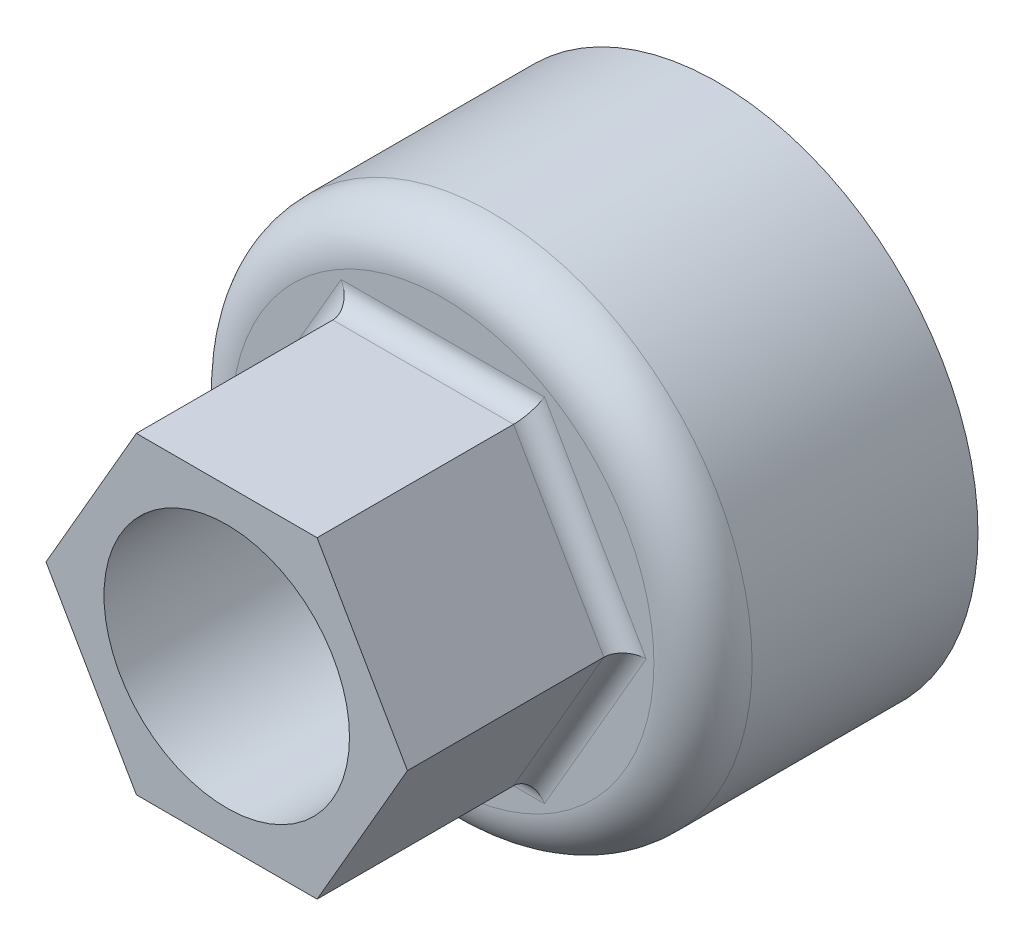
ISO-10303-21;
HEADER;
FILE_DESCRIPTION(('STEP AP214'),'2;1');
FILE_NAME('part.step','',(''),(''),'','','');
FILE_SCHEMA(('AUTOMOTIVE_DESIGN { 1 0 10303 214 1 1 1 1 }'));
ENDSEC;
DATA;
#1=APPLICATION_CONTEXT('core data for automotive mechanical design processes');
#2=APPLICATION_PROTOCOL_DEFINITION('international standard','automotive_design',2000,#1);
#3=PRODUCT_CONTEXT('',#1,'mechanical');
#4=PRODUCT('Part','Part','',(#3));
#5=PRODUCT_RELATED_PRODUCT_CATEGORY('part','',(#4));
#6=PRODUCT_DEFINITION_FORMATION('','',#4);
#7=PRODUCT_DEFINITION_CONTEXT('part definition',#1,'design');
#8=PRODUCT_DEFINITION('design','',#6,#7);
#9=PRODUCT_DEFINITION_SHAPE('','',#8);
#10=(LENGTH_UNIT() NAMED_UNIT(*) SI_UNIT(.MILLI.,.METRE.));
#11=(NAMED_UNIT(*) PLANE_ANGLE_UNIT() SI_UNIT($,.RADIAN.));
#12=(NAMED_UNIT(*) SI_UNIT($,.STERADIAN.) SOLID_ANGLE_UNIT());
#13=UNCERTAINTY_MEASURE_WITH_UNIT(LENGTH_MEASURE(1.E-05),#10,'distance_accuracy_value','');
#14=(GEOMETRIC_REPRESENTATION_CONTEXT(3) GLOBAL_UNCERTAINTY_ASSIGNED_CONTEXT((#13)) GLOBAL_UNIT_ASSIGNED_CONTEXT((#10,
#11,#12)) REPRESENTATION_CONTEXT('',''));
#15=CARTESIAN_POINT('',(0.,0.,0.));
#16=DIRECTION('',(0.,0.,1.));
#17=DIRECTION('',(1.,0.,0.));
#18=AXIS2_PLACEMENT_3D('',#15,#16,#17);
#19=CARTESIAN_POINT('',(0.,0.,25.));
#20=DIRECTION('',(0.,0.,-1.));
#21=DIRECTION('',(-1.,0.,0.));
#22=AXIS2_PLACEMENT_3D('',#19,#20,#21);
#23=CYLINDRICAL_SURFACE('',#22,26.5);
#24=CARTESIAN_POINT('',(0.,0.,23.));
#25=DIRECTION('',(0.,0.,1.));
#26=DIRECTION('',(1.,0.,0.));
#27=AXIS2_PLACEMENT_3D('',#24,#25,#26);
#28=CIRCLE('',#27,26.5);
#29=CARTESIAN_POINT('',(26.5,0.,23.));
#30=VERTEX_POINT('',#29);
#31=EDGE_CURVE('E11',#30,#30,#28,.F.);
#32=ORIENTED_EDGE('',*,*,#31,.T.);
#33=EDGE_LOOP('',(#32));
#34=FACE_BOUND('',#33,.T.);
#35=CARTESIAN_POINT('',(0.,0.,0.));
#36=DIRECTION('',(0.,0.,1.));
#37=DIRECTION('',(1.,0.,0.));
#38=AXIS2_PLACEMENT_3D('',#35,#36,#37);
#39=CIRCLE('',#38,26.5);
#40=CARTESIAN_POINT('',(26.5,0.,0.));
#41=VERTEX_POINT('',#40);
#42=EDGE_CURVE('E235',#41,#41,#39,.T.);
#43=ORIENTED_EDGE('',*,*,#42,.T.);
#44=EDGE_LOOP('',(#43));
#45=FACE_BOUND('',#44,.T.);
#46=ADVANCED_FACE('F35',(#34,#45),#23,.T.);
#47=CARTESIAN_POINT('',(0.,0.,0.));
#48=DIRECTION('',(0.,0.,1.));
#49=DIRECTION('',(1.,0.,0.));
#50=AXIS2_PLACEMENT_3D('',#47,#48,#49);
#51=PLANE('',#50);
#52=ORIENTED_EDGE('',*,*,#42,.F.);
#53=EDGE_LOOP('',(#52));
#54=FACE_BOUND('',#53,.T.);
#55=DIRECTION('',(-0.5,0.866025403784438,0.));
#56=VECTOR('',#55,1.);
#57=CARTESIAN_POINT('',(20.8423447177455,0.,0.));
#58=LINE('',#57,#56);
#59=CARTESIAN_POINT('',(20.8423447177455,0.,0.));
#60=VERTEX_POINT('',#59);
#61=CARTESIAN_POINT('',(10.4211723588727,18.05,0.));
#62=VERTEX_POINT('',#61);
#63=EDGE_CURVE('E200',#60,#62,#58,.T.);
#64=ORIENTED_EDGE('',*,*,#63,.T.);
#65=DIRECTION('',(-1.,0.,0.));
#66=VECTOR('',#65,1.);
#67=CARTESIAN_POINT('',(10.4211723588727,18.05,0.));
#68=LINE('',#67,#66);
#69=CARTESIAN_POINT('',(-10.4211723588727,18.05,0.));
#70=VERTEX_POINT('',#69);
#71=EDGE_CURVE('E208',#62,#70,#68,.T.);
#72=ORIENTED_EDGE('',*,*,#71,.T.);
#73=DIRECTION('',(-0.5,-0.866025403784439,0.));
#74=VECTOR('',#73,1.);
#75=CARTESIAN_POINT('',(-10.4211723588727,18.05,0.));
#76=LINE('',#75,#74);
#77=CARTESIAN_POINT('',(-20.8423447177455,0.,0.));
#78=VERTEX_POINT('',#77);
#79=EDGE_CURVE('E211',#70,#78,#76,.T.);
#80=ORIENTED_EDGE('',*,*,#79,.T.);
#81=DIRECTION('',(0.5,-0.866025403784439,0.));
#82=VECTOR('',#81,1.);
#83=CARTESIAN_POINT('',(-20.8423447177455,0.,0.));
#84=LINE('',#83,#82);
#85=CARTESIAN_POINT('',(-10.4211723588727,-18.05,0.));
#86=VERTEX_POINT('',#85);
#87=EDGE_CURVE('E214',#78,#86,#84,.T.);
#88=ORIENTED_EDGE('',*,*,#87,.T.);
#89=DIRECTION('',(1.,0.,0.));
#90=VECTOR('',#89,1.);
#91=CARTESIAN_POINT('',(-10.4211723588727,-18.05,0.));
#92=LINE('',#91,#90);
#93=CARTESIAN_POINT('',(10.4211723588727,-18.05,0.));
#94=VERTEX_POINT('',#93);
#95=EDGE_CURVE('E217',#86,#94,#92,.T.);
#96=ORIENTED_EDGE('',*,*,#95,.T.);
#97=DIRECTION('',(0.5,0.866025403784439,0.));
#98=VECTOR('',#97,1.);
#99=CARTESIAN_POINT('',(10.4211723588727,-18.05,0.));
#100=LINE('',#99,#98);
#101=EDGE_CURVE('E220',#94,#60,#100,.T.);
#102=ORIENTED_EDGE('',*,*,#101,.T.);
#103=EDGE_LOOP('',(#64,#72,#80,#88,#96,#102));
#104=FACE_BOUND('',#103,.T.);
#105=ADVANCED_FACE('F340',(#54,#104),#51,.F.);
#106=CARTESIAN_POINT('',(20.8423447177455,0.,25.));
#107=DIRECTION('',(-0.866025403784438,-0.5,0.));
#108=DIRECTION('',(0.5,-0.866025403784439,0.));
#109=AXIS2_PLACEMENT_3D('',#106,#107,#108);
#110=PLANE('',#109);
#111=DIRECTION('',(0.,0.,-1.));
#112=VECTOR('',#111,1.);
#113=CARTESIAN_POINT('',(20.8423447177455,0.,25.));
#114=LINE('',#113,#112);
#115=CARTESIAN_POINT('',(20.8423447177455,0.,20.));
#116=VERTEX_POINT('',#115);
#117=EDGE_CURVE('E223',#116,#60,#114,.T.);
#118=ORIENTED_EDGE('',*,*,#117,.F.);
#119=DIRECTION('',(-0.5,0.866025403784439,0.));
#120=VECTOR('',#119,1.);
#121=CARTESIAN_POINT('',(20.8423447177455,0.,20.));
#122=LINE('',#121,#120);
#123=CARTESIAN_POINT('',(10.4211723588727,18.05,20.));
#124=VERTEX_POINT('',#123);
#125=EDGE_CURVE('E302',#116,#124,#122,.T.);
#126=ORIENTED_EDGE('',*,*,#125,.T.);
#127=DIRECTION('',(0.,0.,-1.));
#128=VECTOR('',#127,1.);
#129=CARTESIAN_POINT('',(10.4211723588727,18.05,25.));
#130=LINE('',#129,#128);
#131=EDGE_CURVE('E233',#124,#62,#130,.T.);
#132=ORIENTED_EDGE('',*,*,#131,.T.);
#133=ORIENTED_EDGE('',*,*,#63,.F.);
#134=EDGE_LOOP('',(#118,#126,#132,#133));
#135=FACE_BOUND('',#134,.T.);
#136=ADVANCED_FACE('F346',(#135),#110,.T.);
#137=CARTESIAN_POINT('',(10.4211723588727,18.05,25.));
#138=DIRECTION('',(0.,-1.,0.));
#139=DIRECTION('',(1.,0.,0.));
#140=AXIS2_PLACEMENT_3D('',#137,#138,#139);
#141=PLANE('',#140);
#142=ORIENTED_EDGE('',*,*,#131,.F.);
#143=DIRECTION('',(-1.,0.,0.));
#144=VECTOR('',#143,1.);
#145=CARTESIAN_POINT('',(10.4211723588727,18.05,20.));
#146=LINE('',#145,#144);
#147=CARTESIAN_POINT('',(-10.4211723588727,18.05,20.));
#148=VERTEX_POINT('',#147);
#149=EDGE_CURVE('E263',#124,#148,#146,.T.);
#150=ORIENTED_EDGE('',*,*,#149,.T.);
#151=DIRECTION('',(0.,0.,-1.));
#152=VECTOR('',#151,1.);
#153=CARTESIAN_POINT('',(-10.4211723588727,18.05,25.));
#154=LINE('',#153,#152);
#155=EDGE_CURVE('E231',#148,#70,#154,.T.);
#156=ORIENTED_EDGE('',*,*,#155,.T.);
#157=ORIENTED_EDGE('',*,*,#71,.F.);
#158=EDGE_LOOP('',(#142,#150,#156,#157));
#159=FACE_BOUND('',#158,.T.);
#160=ADVANCED_FACE('F416',(#159),#141,.T.);
#161=CARTESIAN_POINT('',(-10.4211723588727,18.05,25.));
#162=DIRECTION('',(0.866025403784439,-0.5,0.));
#163=DIRECTION('',(0.5,0.866025403784439,0.));
#164=AXIS2_PLACEMENT_3D('',#161,#162,#163);
#165=PLANE('',#164);
#166=ORIENTED_EDGE('',*,*,#155,.F.);
#167=DIRECTION('',(-0.5,-0.866025403784439,0.));
#168=VECTOR('',#167,1.);
#169=CARTESIAN_POINT('',(-10.4211723588727,18.05,20.));
#170=LINE('',#169,#168);
#171=CARTESIAN_POINT('',(-20.8423447177455,0.,20.));
#172=VERTEX_POINT('',#171);
#173=EDGE_CURVE('E296',#148,#172,#170,.T.);
#174=ORIENTED_EDGE('',*,*,#173,.T.);
#175=DIRECTION('',(0.,0.,-1.));
#176=VECTOR('',#175,1.);
#177=CARTESIAN_POINT('',(-20.8423447177455,0.,25.));
#178=LINE('',#177,#176);
#179=EDGE_CURVE('E229',#172,#78,#178,.T.);
#180=ORIENTED_EDGE('',*,*,#179,.T.);
#181=ORIENTED_EDGE('',*,*,#79,.F.);
#182=EDGE_LOOP('',(#166,#174,#180,#181));
#183=FACE_BOUND('',#182,.T.);
#184=ADVANCED_FACE('F431',(#183),#165,.T.);
#185=CARTESIAN_POINT('',(-20.8423447177455,0.,25.));
#186=DIRECTION('',(0.866025403784439,0.5,0.));
#187=DIRECTION('',(-0.5,0.866025403784439,0.));
#188=AXIS2_PLACEMENT_3D('',#185,#186,#187);
#189=PLANE('',#188);
#190=ORIENTED_EDGE('',*,*,#179,.F.);
#191=DIRECTION('',(0.5,-0.866025403784439,0.));
#192=VECTOR('',#191,1.);
#193=CARTESIAN_POINT('',(-20.8423447177455,0.,20.));
#194=LINE('',#193,#192);
#195=CARTESIAN_POINT('',(-10.4211723588727,-18.05,20.));
#196=VERTEX_POINT('',#195);
#197=EDGE_CURVE('E298',#172,#196,#194,.T.);
#198=ORIENTED_EDGE('',*,*,#197,.T.);
#199=DIRECTION('',(0.,0.,-1.));
#200=VECTOR('',#199,1.);
#201=CARTESIAN_POINT('',(-10.4211723588727,-18.05,25.));
#202=LINE('',#201,#200);
#203=EDGE_CURVE('E227',#196,#86,#202,.T.);
#204=ORIENTED_EDGE('',*,*,#203,.T.);
#205=ORIENTED_EDGE('',*,*,#87,.F.);
#206=EDGE_LOOP('',(#190,#198,#204,#205));
#207=FACE_BOUND('',#206,.T.);
#208=ADVANCED_FACE('F427',(#207),#189,.T.);
#209=CARTESIAN_POINT('',(-10.4211723588727,-18.05,25.));
#210=DIRECTION('',(0.,1.,0.));
#211=DIRECTION('',(-1.,0.,0.));
#212=AXIS2_PLACEMENT_3D('',#209,#210,#211);
#213=PLANE('',#212);
#214=ORIENTED_EDGE('',*,*,#203,.F.);
#215=DIRECTION('',(1.,0.,0.));
#216=VECTOR('',#215,1.);
#217=CARTESIAN_POINT('',(-10.4211723588727,-18.05,20.));
#218=LINE('',#217,#216);
#219=CARTESIAN_POINT('',(10.4211723588727,-18.05,20.));
#220=VERTEX_POINT('',#219);
#221=EDGE_CURVE('E58',#196,#220,#218,.T.);
#222=ORIENTED_EDGE('',*,*,#221,.T.);
#223=DIRECTION('',(0.,0.,-1.));
#224=VECTOR('',#223,1.);
#225=CARTESIAN_POINT('',(10.4211723588727,-18.05,25.));
#226=LINE('',#225,#224);
#227=EDGE_CURVE('E225',#220,#94,#226,.T.);
#228=ORIENTED_EDGE('',*,*,#227,.T.);
#229=ORIENTED_EDGE('',*,*,#95,.F.);
#230=EDGE_LOOP('',(#214,#222,#228,#229));
#231=FACE_BOUND('',#230,.T.);
#232=ADVANCED_FACE('F423',(#231),#213,.T.);
#233=CARTESIAN_POINT('',(10.4211723588727,-18.05,25.));
#234=DIRECTION('',(-0.866025403784439,0.5,0.));
#235=DIRECTION('',(-0.5,-0.866025403784439,0.));
#236=AXIS2_PLACEMENT_3D('',#233,#234,#235);
#237=PLANE('',#236);
#238=ORIENTED_EDGE('',*,*,#227,.F.);
#239=DIRECTION('',(0.5,0.866025403784439,0.));
#240=VECTOR('',#239,1.);
#241=CARTESIAN_POINT('',(10.4211723588727,-18.05,20.));
#242=LINE('',#241,#240);
#243=EDGE_CURVE('E50',#220,#116,#242,.T.);
#244=ORIENTED_EDGE('',*,*,#243,.T.);
#245=ORIENTED_EDGE('',*,*,#117,.T.);
#246=ORIENTED_EDGE('',*,*,#101,.F.);
#247=EDGE_LOOP('',(#238,#244,#245,#246));
#248=FACE_BOUND('',#247,.T.);
#249=ADVANCED_FACE('F422',(#248),#237,.T.);
#250=CARTESIAN_POINT('',(0.,0.,25.));
#251=DIRECTION('',(0.,0.,1.));
#252=DIRECTION('',(1.,0.,0.));
#253=AXIS2_PLACEMENT_3D('',#250,#251,#252);
#254=PLANE('',#253);
#255=CARTESIAN_POINT('',(0.,0.,25.));
#256=DIRECTION('',(0.,0.,1.));
#257=DIRECTION('',(1.,0.,0.));
#258=AXIS2_PLACEMENT_3D('',#255,#256,#257);
#259=CIRCLE('',#258,12.5);
#260=CARTESIAN_POINT('',(12.5,0.,25.));
#261=VERTEX_POINT('',#260);
#262=EDGE_CURVE('E307',#261,#261,#259,.T.);
#263=ORIENTED_EDGE('',*,*,#262,.T.);
#264=EDGE_LOOP('',(#263));
#265=FACE_BOUND('',#264,.T.);
#266=DIRECTION('',(-0.5,-0.866025403784439,0.));
#267=VECTOR('',#266,1.);
#268=CARTESIAN_POINT('',(-11.3016315193869,6.525,25.));
#269=LINE('',#268,#267);
#270=CARTESIAN_POINT('',(-15.0688420258492,0.,25.));
#271=VERTEX_POINT('',#270);
#272=CARTESIAN_POINT('',(-7.53442101292462,13.05,25.));
#273=VERTEX_POINT('',#272);
#274=EDGE_CURVE('E291',#271,#273,#269,.F.);
#275=ORIENTED_EDGE('',*,*,#274,.T.);
#276=DIRECTION('',(-1.,0.,0.));
#277=VECTOR('',#276,1.);
#278=CARTESIAN_POINT('',(0.,13.05,25.));
#279=LINE('',#278,#277);
#280=CARTESIAN_POINT('',(7.53442101292461,13.05,25.));
#281=VERTEX_POINT('',#280);
#282=EDGE_CURVE('E293',#273,#281,#279,.F.);
#283=ORIENTED_EDGE('',*,*,#282,.T.);
#284=DIRECTION('',(-0.5,0.866025403784439,0.));
#285=VECTOR('',#284,1.);
#286=CARTESIAN_POINT('',(11.3016315193869,6.525,25.));
#287=LINE('',#286,#285);
#288=CARTESIAN_POINT('',(15.0688420258492,0.,25.));
#289=VERTEX_POINT('',#288);
#290=EDGE_CURVE('E283',#281,#289,#287,.F.);
#291=ORIENTED_EDGE('',*,*,#290,.T.);
#292=DIRECTION('',(0.5,0.866025403784439,0.));
#293=VECTOR('',#292,1.);
#294=CARTESIAN_POINT('',(11.3016315193869,-6.525,25.));
#295=LINE('',#294,#293);
#296=CARTESIAN_POINT('',(7.53442101292462,-13.05,25.));
#297=VERTEX_POINT('',#296);
#298=EDGE_CURVE('E285',#289,#297,#295,.F.);
#299=ORIENTED_EDGE('',*,*,#298,.T.);
#300=DIRECTION('',(1.,0.,0.));
#301=VECTOR('',#300,1.);
#302=CARTESIAN_POINT('',(0.,-13.05,25.));
#303=LINE('',#302,#301);
#304=CARTESIAN_POINT('',(-7.53442101292462,-13.05,25.));
#305=VERTEX_POINT('',#304);
#306=EDGE_CURVE('E287',#297,#305,#303,.F.);
#307=ORIENTED_EDGE('',*,*,#306,.T.);
#308=DIRECTION('',(0.5,-0.866025403784439,0.));
#309=VECTOR('',#308,1.);
#310=CARTESIAN_POINT('',(-11.3016315193869,-6.525,25.));
#311=LINE('',#310,#309);
#312=EDGE_CURVE('E289',#305,#271,#311,.F.);
#313=ORIENTED_EDGE('',*,*,#312,.T.);
#314=EDGE_LOOP('',(#275,#283,#291,#299,#307,#313));
#315=FACE_BOUND('',#314,.T.);
#316=ADVANCED_FACE('F403',(#265,#315),#254,.F.);
#317=CARTESIAN_POINT('',(0.,0.,28.));
#318=DIRECTION('',(0.,0.,1.));
#319=DIRECTION('',(1.,0.,0.));
#320=AXIS2_PLACEMENT_3D('',#317,#318,#319);
#321=PLANE('',#320);
#322=CARTESIAN_POINT('',(0.,0.,28.));
#323=DIRECTION('',(0.,0.,1.));
#324=DIRECTION('',(1.,0.,0.));
#325=AXIS2_PLACEMENT_3D('',#322,#323,#324);
#326=CIRCLE('',#325,21.5);
#327=CARTESIAN_POINT('',(21.5,0.,28.));
#328=VERTEX_POINT('',#327);
#329=EDGE_CURVE('E43',#328,#328,#326,.T.);
#330=ORIENTED_EDGE('',*,*,#329,.T.);
#331=EDGE_LOOP('',(#330));
#332=FACE_BOUND('',#331,.T.);
#333=DIRECTION('',(-1.,0.,0.));
#334=VECTOR('',#333,1.);
#335=CARTESIAN_POINT('',(9.20178694020821,17.9379625008644,28.));
#336=LINE('',#335,#334);
#337=CARTESIAN_POINT('',(-10.3564874785875,17.9379625008644,28.));
#338=VERTEX_POINT('',#337);
#339=CARTESIAN_POINT('',(10.3564874785875,17.9379625008644,28.));
#340=VERTEX_POINT('',#339);
#341=EDGE_CURVE('E249',#338,#340,#336,.F.);
#342=ORIENTED_EDGE('',*,*,#341,.T.);
#343=DIRECTION('',(-0.5,0.866025403784439,0.));
#344=VECTOR('',#343,1.);
#345=CARTESIAN_POINT('',(20.1356246879853,0.999999999999995,28.));
#346=LINE('',#345,#344);
#347=CARTESIAN_POINT('',(20.7129749571749,0.,28.));
#348=VERTEX_POINT('',#347);
#349=EDGE_CURVE('E251',#340,#348,#346,.F.);
#350=ORIENTED_EDGE('',*,*,#349,.T.);
#351=DIRECTION('',(0.5,0.866025403784439,0.));
#352=VECTOR('',#351,1.);
#353=CARTESIAN_POINT('',(10.9338377477771,-16.9379625008644,28.));
#354=LINE('',#353,#352);
#355=CARTESIAN_POINT('',(10.3564874785875,-17.9379625008644,28.));
#356=VERTEX_POINT('',#355);
#357=EDGE_CURVE('E241',#348,#356,#354,.F.);
#358=ORIENTED_EDGE('',*,*,#357,.T.);
#359=DIRECTION('',(1.,0.,0.));
#360=VECTOR('',#359,1.);
#361=CARTESIAN_POINT('',(-9.20178694020821,-17.9379625008644,28.));
#362=LINE('',#361,#360);
#363=CARTESIAN_POINT('',(-10.3564874785875,-17.9379625008644,28.));
#364=VERTEX_POINT('',#363);
#365=EDGE_CURVE('E243',#356,#364,#362,.F.);
#366=ORIENTED_EDGE('',*,*,#365,.T.);
#367=DIRECTION('',(0.5,-0.866025403784439,0.));
#368=VECTOR('',#367,1.);
#369=CARTESIAN_POINT('',(-20.1356246879853,-1.00000000000001,28.));
#370=LINE('',#369,#368);
#371=CARTESIAN_POINT('',(-20.7129749571749,0.,28.));
#372=VERTEX_POINT('',#371);
#373=EDGE_CURVE('E245',#364,#372,#370,.F.);
#374=ORIENTED_EDGE('',*,*,#373,.T.);
#375=DIRECTION('',(-0.5,-0.866025403784439,0.));
#376=VECTOR('',#375,1.);
#377=CARTESIAN_POINT('',(-10.9338377477771,16.9379625008644,28.));
#378=LINE('',#377,#376);
#379=EDGE_CURVE('E247',#372,#338,#378,.F.);
#380=ORIENTED_EDGE('',*,*,#379,.T.);
#381=EDGE_LOOP('',(#342,#350,#358,#366,#374,#380));
#382=FACE_BOUND('',#381,.T.);
#383=ADVANCED_FACE('F322',(#332,#382),#321,.T.);
#384=CARTESIAN_POINT('',(18.4035738804164,0.,28.));
#385=DIRECTION('',(0.866025403784439,0.5,0.));
#386=DIRECTION('',(-0.5,0.866025403784439,0.));
#387=AXIS2_PLACEMENT_3D('',#384,#385,#386);
#388=PLANE('',#387);
#389=DIRECTION('',(0.,0.,1.));
#390=VECTOR('',#389,1.);
#391=CARTESIAN_POINT('',(18.4035738804164,0.,28.));
#392=LINE('',#391,#390);
#393=CARTESIAN_POINT('',(18.4035738804164,0.,30.));
#394=VERTEX_POINT('',#393);
#395=CARTESIAN_POINT('',(18.4035738804164,0.,50.));
#396=VERTEX_POINT('',#395);
#397=EDGE_CURVE('E198',#394,#396,#392,.T.);
#398=ORIENTED_EDGE('',*,*,#397,.F.);
#399=DIRECTION('',(-0.5,0.866025403784439,0.));
#400=VECTOR('',#399,1.);
#401=CARTESIAN_POINT('',(9.20178694020821,15.9379625008644,30.));
#402=LINE('',#401,#400);
#403=CARTESIAN_POINT('',(9.20178694020821,15.9379625008644,30.));
#404=VERTEX_POINT('',#403);
#405=EDGE_CURVE('E238',#394,#404,#402,.T.);
#406=ORIENTED_EDGE('',*,*,#405,.T.);
#407=DIRECTION('',(0.,0.,1.));
#408=VECTOR('',#407,1.);
#409=CARTESIAN_POINT('',(9.20178694020821,15.9379625008644,28.));
#410=LINE('',#409,#408);
#411=CARTESIAN_POINT('',(9.20178694020821,15.9379625008644,50.));
#412=VERTEX_POINT('',#411);
#413=EDGE_CURVE('E197',#404,#412,#410,.T.);
#414=ORIENTED_EDGE('',*,*,#413,.T.);
#415=DIRECTION('',(-0.5,0.866025403784439,0.));
#416=VECTOR('',#415,1.);
#417=CARTESIAN_POINT('',(18.4035738804164,0.,50.));
#418=LINE('',#417,#416);
#419=EDGE_CURVE('E190',#396,#412,#418,.T.);
#420=ORIENTED_EDGE('',*,*,#419,.F.);
#421=EDGE_LOOP('',(#398,#406,#414,#420));
#422=FACE_BOUND('',#421,.T.);
#423=ADVANCED_FACE('F527',(#422),#388,.T.);
#424=CARTESIAN_POINT('',(9.20178694020821,-15.9379625008644,28.));
#425=DIRECTION('',(0.866025403784439,-0.5,0.));
#426=DIRECTION('',(0.5,0.866025403784439,0.));
#427=AXIS2_PLACEMENT_3D('',#424,#425,#426);
#428=PLANE('',#427);
#429=DIRECTION('',(0.,0.,1.));
#430=VECTOR('',#429,1.);
#431=CARTESIAN_POINT('',(9.20178694020821,-15.9379625008644,28.));
#432=LINE('',#431,#430);
#433=CARTESIAN_POINT('',(9.20178694020821,-15.9379625008644,30.));
#434=VERTEX_POINT('',#433);
#435=CARTESIAN_POINT('',(9.20178694020821,-15.9379625008644,50.));
#436=VERTEX_POINT('',#435);
#437=EDGE_CURVE('E201',#434,#436,#432,.T.);
#438=ORIENTED_EDGE('',*,*,#437,.F.);
#439=DIRECTION('',(0.5,0.866025403784439,0.));
#440=VECTOR('',#439,1.);
#441=CARTESIAN_POINT('',(18.4035738804164,0.,30.));
#442=LINE('',#441,#440);
#443=EDGE_CURVE('E261',#434,#394,#442,.T.);
#444=ORIENTED_EDGE('',*,*,#443,.T.);
#445=ORIENTED_EDGE('',*,*,#397,.T.);
#446=DIRECTION('',(0.5,0.866025403784439,0.));
#447=VECTOR('',#446,1.);
#448=CARTESIAN_POINT('',(9.20178694020821,-15.9379625008644,50.));
#449=LINE('',#448,#447);
#450=EDGE_CURVE('E195',#436,#396,#449,.T.);
#451=ORIENTED_EDGE('',*,*,#450,.F.);
#452=EDGE_LOOP('',(#438,#444,#445,#451));
#453=FACE_BOUND('',#452,.T.);
#454=ADVANCED_FACE('F624',(#453),#428,.T.);
#455=CARTESIAN_POINT('',(-9.20178694020821,-15.9379625008644,28.));
#456=DIRECTION('',(0.,-1.,0.));
#457=DIRECTION('',(0.,0.,-1.));
#458=AXIS2_PLACEMENT_3D('',#455,#456,#457);
#459=PLANE('',#458);
#460=DIRECTION('',(0.,0.,1.));
#461=VECTOR('',#460,1.);
#462=CARTESIAN_POINT('',(-9.20178694020821,-15.9379625008644,28.));
#463=LINE('',#462,#461);
#464=CARTESIAN_POINT('',(-9.20178694020821,-15.9379625008644,30.));
#465=VERTEX_POINT('',#464);
#466=CARTESIAN_POINT('',(-9.20178694020821,-15.9379625008644,50.));
#467=VERTEX_POINT('',#466);
#468=EDGE_CURVE('E172',#465,#467,#463,.T.);
#469=ORIENTED_EDGE('',*,*,#468,.F.);
#470=DIRECTION('',(1.,0.,0.));
#471=VECTOR('',#470,1.);
#472=CARTESIAN_POINT('',(9.2017869402082,-15.9379625008644,30.));
#473=LINE('',#472,#471);
#474=EDGE_CURVE('E259',#465,#434,#473,.T.);
#475=ORIENTED_EDGE('',*,*,#474,.T.);
#476=ORIENTED_EDGE('',*,*,#437,.T.);
#477=DIRECTION('',(1.,0.,0.));
#478=VECTOR('',#477,1.);
#479=CARTESIAN_POINT('',(-9.20178694020821,-15.9379625008644,50.));
#480=LINE('',#479,#478);
#481=EDGE_CURVE('E182',#467,#436,#480,.T.);
#482=ORIENTED_EDGE('',*,*,#481,.F.);
#483=EDGE_LOOP('',(#469,#475,#476,#482));
#484=FACE_BOUND('',#483,.T.);
#485=ADVANCED_FACE('F616',(#484),#459,.T.);
#486=CARTESIAN_POINT('',(-18.4035738804164,0.,28.));
#487=DIRECTION('',(-0.866025403784439,-0.5,0.));
#488=DIRECTION('',(0.5,-0.866025403784439,0.));
#489=AXIS2_PLACEMENT_3D('',#486,#487,#488);
#490=PLANE('',#489);
#491=DIRECTION('',(0.,0.,1.));
#492=VECTOR('',#491,1.);
#493=CARTESIAN_POINT('',(-18.4035738804164,0.,28.));
#494=LINE('',#493,#492);
#495=CARTESIAN_POINT('',(-18.4035738804164,0.,30.));
#496=VERTEX_POINT('',#495);
#497=CARTESIAN_POINT('',(-18.4035738804164,0.,50.));
#498=VERTEX_POINT('',#497);
#499=EDGE_CURVE('E161',#496,#498,#494,.T.);
#500=ORIENTED_EDGE('',*,*,#499,.F.);
#501=DIRECTION('',(0.5,-0.866025403784439,0.));
#502=VECTOR('',#501,1.);
#503=CARTESIAN_POINT('',(-9.20178694020821,-15.9379625008644,30.));
#504=LINE('',#503,#502);
#505=EDGE_CURVE('E257',#496,#465,#504,.T.);
#506=ORIENTED_EDGE('',*,*,#505,.T.);
#507=ORIENTED_EDGE('',*,*,#468,.T.);
#508=DIRECTION('',(0.5,-0.866025403784439,0.));
#509=VECTOR('',#508,1.);
#510=CARTESIAN_POINT('',(-18.4035738804164,0.,50.));
#511=LINE('',#510,#509);
#512=EDGE_CURVE('E176',#498,#467,#511,.T.);
#513=ORIENTED_EDGE('',*,*,#512,.F.);
#514=EDGE_LOOP('',(#500,#506,#507,#513));
#515=FACE_BOUND('',#514,.T.);
#516=ADVANCED_FACE('F177',(#515),#490,.T.);
#517=CARTESIAN_POINT('',(-9.2017869402082,15.9379625008644,28.));
#518=DIRECTION('',(-0.866025403784439,0.5,0.));
#519=DIRECTION('',(-0.5,-0.866025403784439,0.));
#520=AXIS2_PLACEMENT_3D('',#517,#518,#519);
#521=PLANE('',#520);
#522=DIRECTION('',(0.,0.,1.));
#523=VECTOR('',#522,1.);
#524=CARTESIAN_POINT('',(-9.2017869402082,15.9379625008644,28.));
#525=LINE('',#524,#523);
#526=CARTESIAN_POINT('',(-9.2017869402082,15.9379625008644,30.));
#527=VERTEX_POINT('',#526);
#528=CARTESIAN_POINT('',(-9.2017869402082,15.9379625008644,50.));
#529=VERTEX_POINT('',#528);
#530=EDGE_CURVE('E173',#527,#529,#525,.T.);
#531=ORIENTED_EDGE('',*,*,#530,.F.);
#532=DIRECTION('',(-0.5,-0.866025403784439,0.));
#533=VECTOR('',#532,1.);
#534=CARTESIAN_POINT('',(-18.4035738804164,0.,30.));
#535=LINE('',#534,#533);
#536=EDGE_CURVE('E169',#527,#496,#535,.T.);
#537=ORIENTED_EDGE('',*,*,#536,.T.);
#538=ORIENTED_EDGE('',*,*,#499,.T.);
#539=DIRECTION('',(-0.5,-0.866025403784439,0.));
#540=VECTOR('',#539,1.);
#541=CARTESIAN_POINT('',(-9.2017869402082,15.9379625008644,50.));
#542=LINE('',#541,#540);
#543=EDGE_CURVE('E166',#529,#498,#542,.T.);
#544=ORIENTED_EDGE('',*,*,#543,.F.);
#545=EDGE_LOOP('',(#531,#537,#538,#544));
#546=FACE_BOUND('',#545,.T.);
#547=ADVANCED_FACE('F164',(#546),#521,.T.);
#548=CARTESIAN_POINT('',(9.20178694020821,15.9379625008644,28.));
#549=DIRECTION('',(0.,1.,0.));
#550=DIRECTION('',(-1.,0.,0.));
#551=AXIS2_PLACEMENT_3D('',#548,#549,#550);
#552=PLANE('',#551);
#553=ORIENTED_EDGE('',*,*,#413,.F.);
#554=DIRECTION('',(-1.,0.,0.));
#555=VECTOR('',#554,1.);
#556=CARTESIAN_POINT('',(-9.2017869402082,15.9379625008644,30.));
#557=LINE('',#556,#555);
#558=EDGE_CURVE('E254',#404,#527,#557,.T.);
#559=ORIENTED_EDGE('',*,*,#558,.T.);
#560=ORIENTED_EDGE('',*,*,#530,.T.);
#561=DIRECTION('',(-1.,0.,0.));
#562=VECTOR('',#561,1.);
#563=CARTESIAN_POINT('',(9.20178694020821,15.9379625008644,50.));
#564=LINE('',#563,#562);
#565=EDGE_CURVE('E188',#412,#529,#564,.T.);
#566=ORIENTED_EDGE('',*,*,#565,.F.);
#567=EDGE_LOOP('',(#553,#559,#560,#566));
#568=FACE_BOUND('',#567,.T.);
#569=ADVANCED_FACE('F550',(#568),#552,.T.);
#570=CARTESIAN_POINT('',(0.,0.,50.));
#571=DIRECTION('',(0.,0.,1.));
#572=DIRECTION('',(1.,0.,0.));
#573=AXIS2_PLACEMENT_3D('',#570,#571,#572);
#574=PLANE('',#573);
#575=CARTESIAN_POINT('',(0.,0.,50.));
#576=DIRECTION('',(0.,0.,1.));
#577=DIRECTION('',(1.,0.,0.));
#578=AXIS2_PLACEMENT_3D('',#575,#576,#577);
#579=CIRCLE('',#578,12.5);
#580=CARTESIAN_POINT('',(12.5,0.,50.));
#581=VERTEX_POINT('',#580);
#582=EDGE_CURVE('E676',#581,#581,#579,.T.);
#583=ORIENTED_EDGE('',*,*,#582,.F.);
#584=EDGE_LOOP('',(#583));
#585=FACE_BOUND('',#584,.T.);
#586=ORIENTED_EDGE('',*,*,#450,.T.);
#587=ORIENTED_EDGE('',*,*,#419,.T.);
#588=ORIENTED_EDGE('',*,*,#565,.T.);
#589=ORIENTED_EDGE('',*,*,#543,.T.);
#590=ORIENTED_EDGE('',*,*,#512,.T.);
#591=ORIENTED_EDGE('',*,*,#481,.T.);
#592=EDGE_LOOP('',(#586,#587,#588,#589,#590,#591));
#593=FACE_BOUND('',#592,.T.);
#594=ADVANCED_FACE('F185',(#585,#593),#574,.T.);
#595=CARTESIAN_POINT('',(-20.1356246879853,-1.00000000000001,30.));
#596=DIRECTION('',(-0.5,0.866025403784439,0.));
#597=DIRECTION('',(-0.866025403784439,-0.5,0.));
#598=AXIS2_PLACEMENT_3D('',#595,#596,#597);
#599=CYLINDRICAL_SURFACE('',#598,2.);
#600=CARTESIAN_POINT('',(-20.7129749571749,0.,30.));
#601=DIRECTION('',(0.,1.,0.));
#602=DIRECTION('',(-1.,0.,0.));
#603=AXIS2_PLACEMENT_3D('',#600,#601,#602);
#604=ELLIPSE('',#603,2.3094010767585,2.);
#605=EDGE_CURVE('E275',#372,#496,#604,.F.);
#606=ORIENTED_EDGE('',*,*,#605,.F.);
#607=ORIENTED_EDGE('',*,*,#373,.F.);
#608=CARTESIAN_POINT('',(-10.3564874785875,-17.9379625008644,30.));
#609=DIRECTION('',(-0.866025403784439,0.5,0.));
#610=DIRECTION('',(-0.5,-0.866025403784439,0.));
#611=AXIS2_PLACEMENT_3D('',#608,#609,#610);
#612=ELLIPSE('',#611,2.3094010767585,2.);
#613=EDGE_CURVE('E278',#465,#364,#612,.T.);
#614=ORIENTED_EDGE('',*,*,#613,.F.);
#615=ORIENTED_EDGE('',*,*,#505,.F.);
#616=EDGE_LOOP('',(#606,#607,#614,#615));
#617=FACE_BOUND('',#616,.T.);
#618=ADVANCED_FACE('F372',(#617),#599,.F.);
#619=CARTESIAN_POINT('',(-9.20178694020821,-17.9379625008644,30.));
#620=DIRECTION('',(-1.,0.,0.));
#621=DIRECTION('',(0.,0.,1.));
#622=AXIS2_PLACEMENT_3D('',#619,#620,#621);
#623=CYLINDRICAL_SURFACE('',#622,2.);
#624=ORIENTED_EDGE('',*,*,#613,.T.);
#625=ORIENTED_EDGE('',*,*,#365,.F.);
#626=CARTESIAN_POINT('',(10.3564874785875,-17.9379625008644,30.));
#627=DIRECTION('',(-0.866025403784439,-0.5,0.));
#628=DIRECTION('',(0.5,-0.866025403784439,0.));
#629=AXIS2_PLACEMENT_3D('',#626,#627,#628);
#630=ELLIPSE('',#629,2.3094010767585,2.);
#631=EDGE_CURVE('E272',#434,#356,#630,.T.);
#632=ORIENTED_EDGE('',*,*,#631,.F.);
#633=ORIENTED_EDGE('',*,*,#474,.F.);
#634=EDGE_LOOP('',(#624,#625,#632,#633));
#635=FACE_BOUND('',#634,.T.);
#636=ADVANCED_FACE('F368',(#635),#623,.F.);
#637=CARTESIAN_POINT('',(-10.9338377477771,16.9379625008644,30.));
#638=DIRECTION('',(0.5,0.866025403784439,0.));
#639=DIRECTION('',(-0.866025403784439,0.5,0.));
#640=AXIS2_PLACEMENT_3D('',#637,#638,#639);
#641=CYLINDRICAL_SURFACE('',#640,2.);
#642=ORIENTED_EDGE('',*,*,#605,.T.);
#643=ORIENTED_EDGE('',*,*,#536,.F.);
#644=CARTESIAN_POINT('',(-10.3564874785875,17.9379625008644,30.));
#645=DIRECTION('',(0.866025403784438,0.5,0.));
#646=DIRECTION('',(-0.5,0.866025403784439,0.));
#647=AXIS2_PLACEMENT_3D('',#644,#645,#646);
#648=ELLIPSE('',#647,2.3094010767585,2.);
#649=EDGE_CURVE('E269',#338,#527,#648,.F.);
#650=ORIENTED_EDGE('',*,*,#649,.F.);
#651=ORIENTED_EDGE('',*,*,#379,.F.);
#652=EDGE_LOOP('',(#642,#643,#650,#651));
#653=FACE_BOUND('',#652,.T.);
#654=ADVANCED_FACE('F364',(#653),#641,.F.);
#655=CARTESIAN_POINT('',(10.9338377477771,-16.9379625008644,30.));
#656=DIRECTION('',(-0.5,-0.866025403784439,0.));
#657=DIRECTION('',(0.866025403784439,-0.5,0.));
#658=AXIS2_PLACEMENT_3D('',#655,#656,#657);
#659=CYLINDRICAL_SURFACE('',#658,2.);
#660=ORIENTED_EDGE('',*,*,#631,.T.);
#661=ORIENTED_EDGE('',*,*,#357,.F.);
#662=CARTESIAN_POINT('',(20.7129749571749,0.,30.));
#663=DIRECTION('',(0.,-1.,0.));
#664=DIRECTION('',(-1.,0.,0.));
#665=AXIS2_PLACEMENT_3D('',#662,#663,#664);
#666=ELLIPSE('',#665,2.3094010767585,2.);
#667=EDGE_CURVE('E266',#394,#348,#666,.T.);
#668=ORIENTED_EDGE('',*,*,#667,.F.);
#669=ORIENTED_EDGE('',*,*,#443,.F.);
#670=EDGE_LOOP('',(#660,#661,#668,#669));
#671=FACE_BOUND('',#670,.T.);
#672=ADVANCED_FACE('F360',(#671),#659,.F.);
#673=CARTESIAN_POINT('',(9.20178694020821,17.9379625008644,30.));
#674=DIRECTION('',(1.,0.,0.));
#675=DIRECTION('',(0.,1.,0.));
#676=AXIS2_PLACEMENT_3D('',#673,#674,#675);
#677=CYLINDRICAL_SURFACE('',#676,2.);
#678=ORIENTED_EDGE('',*,*,#649,.T.);
#679=ORIENTED_EDGE('',*,*,#558,.F.);
#680=CARTESIAN_POINT('',(10.3564874785875,17.9379625008644,30.));
#681=DIRECTION('',(0.866025403784439,-0.5,0.));
#682=DIRECTION('',(0.5,0.866025403784439,0.));
#683=AXIS2_PLACEMENT_3D('',#680,#681,#682);
#684=ELLIPSE('',#683,2.3094010767585,2.);
#685=EDGE_CURVE('E264',#340,#404,#684,.F.);
#686=ORIENTED_EDGE('',*,*,#685,.F.);
#687=ORIENTED_EDGE('',*,*,#341,.F.);
#688=EDGE_LOOP('',(#678,#679,#686,#687));
#689=FACE_BOUND('',#688,.T.);
#690=ADVANCED_FACE('F356',(#689),#677,.F.);
#691=CARTESIAN_POINT('',(20.1356246879853,0.999999999999995,30.));
#692=DIRECTION('',(0.5,-0.866025403784439,0.));
#693=DIRECTION('',(0.866025403784439,0.5,0.));
#694=AXIS2_PLACEMENT_3D('',#691,#692,#693);
#695=CYLINDRICAL_SURFACE('',#694,2.);
#696=ORIENTED_EDGE('',*,*,#667,.T.);
#697=ORIENTED_EDGE('',*,*,#349,.F.);
#698=ORIENTED_EDGE('',*,*,#685,.T.);
#699=ORIENTED_EDGE('',*,*,#405,.F.);
#700=EDGE_LOOP('',(#696,#697,#698,#699));
#701=FACE_BOUND('',#700,.T.);
#702=ADVANCED_FACE('F352',(#701),#695,.F.);
#703=CARTESIAN_POINT('',(-10.4211723588727,-13.05,20.));
#704=DIRECTION('',(1.,0.,0.));
#705=DIRECTION('',(0.,1.,0.));
#706=AXIS2_PLACEMENT_3D('',#703,#704,#705);
#707=CYLINDRICAL_SURFACE('',#706,5.);
#708=CARTESIAN_POINT('',(-7.53442101292462,-13.05,20.));
#709=DIRECTION('',(0.866025403784439,-0.5,0.));
#710=DIRECTION('',(-0.5,-0.866025403784439,0.));
#711=AXIS2_PLACEMENT_3D('',#708,#709,#710);
#712=ELLIPSE('',#711,5.77350269189626,5.);
#713=EDGE_CURVE('E315',#305,#196,#712,.T.);
#714=ORIENTED_EDGE('',*,*,#713,.F.);
#715=ORIENTED_EDGE('',*,*,#306,.F.);
#716=CARTESIAN_POINT('',(7.53442101292461,-13.05,20.));
#717=DIRECTION('',(0.866025403784439,0.5,0.));
#718=DIRECTION('',(0.5,-0.866025403784439,0.));
#719=AXIS2_PLACEMENT_3D('',#716,#717,#718);
#720=ELLIPSE('',#719,5.77350269189626,5.);
#721=EDGE_CURVE('E267',#220,#297,#720,.F.);
#722=ORIENTED_EDGE('',*,*,#721,.F.);
#723=ORIENTED_EDGE('',*,*,#221,.F.);
#724=EDGE_LOOP('',(#714,#715,#722,#723));
#725=FACE_BOUND('',#724,.T.);
#726=ADVANCED_FACE('F355',(#725),#707,.F.);
#727=CARTESIAN_POINT('',(6.09104533995055,-15.55,20.));
#728=DIRECTION('',(0.5,0.866025403784439,0.));
#729=DIRECTION('',(-0.866025403784439,0.5,0.));
#730=AXIS2_PLACEMENT_3D('',#727,#728,#729);
#731=CYLINDRICAL_SURFACE('',#730,5.);
#732=ORIENTED_EDGE('',*,*,#721,.T.);
#733=ORIENTED_EDGE('',*,*,#298,.F.);
#734=CARTESIAN_POINT('',(15.0688420258492,0.,20.));
#735=DIRECTION('',(0.,1.,0.));
#736=DIRECTION('',(1.,0.,0.));
#737=AXIS2_PLACEMENT_3D('',#734,#735,#736);
#738=ELLIPSE('',#737,5.77350269189626,5.);
#739=EDGE_CURVE('E312',#116,#289,#738,.F.);
#740=ORIENTED_EDGE('',*,*,#739,.F.);
#741=ORIENTED_EDGE('',*,*,#243,.F.);
#742=EDGE_LOOP('',(#732,#733,#740,#741));
#743=FACE_BOUND('',#742,.T.);
#744=ADVANCED_FACE('F387',(#743),#731,.F.);
#745=CARTESIAN_POINT('',(-16.5122176988233,2.5,20.));
#746=DIRECTION('',(0.5,-0.866025403784439,0.));
#747=DIRECTION('',(0.866025403784439,0.5,0.));
#748=AXIS2_PLACEMENT_3D('',#745,#746,#747);
#749=CYLINDRICAL_SURFACE('',#748,5.);
#750=ORIENTED_EDGE('',*,*,#713,.T.);
#751=ORIENTED_EDGE('',*,*,#197,.F.);
#752=CARTESIAN_POINT('',(-15.0688420258492,0.,20.));
#753=DIRECTION('',(0.,-1.,0.));
#754=DIRECTION('',(-1.,0.,0.));
#755=AXIS2_PLACEMENT_3D('',#752,#753,#754);
#756=ELLIPSE('',#755,5.77350269189626,5.);
#757=EDGE_CURVE('E309',#271,#172,#756,.T.);
#758=ORIENTED_EDGE('',*,*,#757,.F.);
#759=ORIENTED_EDGE('',*,*,#312,.F.);
#760=EDGE_LOOP('',(#750,#751,#758,#759));
#761=FACE_BOUND('',#760,.T.);
#762=ADVANCED_FACE('F383',(#761),#749,.F.);
#763=CARTESIAN_POINT('',(16.5122176988233,-2.5,20.));
#764=DIRECTION('',(-0.5,0.866025403784439,0.));
#765=DIRECTION('',(-0.866025403784438,-0.5,0.));
#766=AXIS2_PLACEMENT_3D('',#763,#764,#765);
#767=CYLINDRICAL_SURFACE('',#766,5.);
#768=ORIENTED_EDGE('',*,*,#739,.T.);
#769=ORIENTED_EDGE('',*,*,#290,.F.);
#770=CARTESIAN_POINT('',(7.53442101292461,13.05,20.));
#771=DIRECTION('',(-0.866025403784439,0.5,0.));
#772=DIRECTION('',(-0.5,-0.866025403784439,0.));
#773=AXIS2_PLACEMENT_3D('',#770,#771,#772);
#774=ELLIPSE('',#773,5.77350269189626,5.);
#775=EDGE_CURVE('E306',#124,#281,#774,.F.);
#776=ORIENTED_EDGE('',*,*,#775,.F.);
#777=ORIENTED_EDGE('',*,*,#125,.F.);
#778=EDGE_LOOP('',(#768,#769,#776,#777));
#779=FACE_BOUND('',#778,.T.);
#780=ADVANCED_FACE('F379',(#779),#767,.F.);
#781=CARTESIAN_POINT('',(-6.09104533995055,15.55,20.));
#782=DIRECTION('',(-0.5,-0.866025403784439,0.));
#783=DIRECTION('',(0.866025403784439,-0.5,0.));
#784=AXIS2_PLACEMENT_3D('',#781,#782,#783);
#785=CYLINDRICAL_SURFACE('',#784,5.);
#786=ORIENTED_EDGE('',*,*,#757,.T.);
#787=ORIENTED_EDGE('',*,*,#173,.F.);
#788=CARTESIAN_POINT('',(-7.53442101292462,13.05,20.));
#789=DIRECTION('',(-0.866025403784439,-0.5,0.));
#790=DIRECTION('',(-0.5,0.866025403784438,0.));
#791=AXIS2_PLACEMENT_3D('',#788,#789,#790);
#792=ELLIPSE('',#791,5.77350269189626,5.);
#793=EDGE_CURVE('E304',#273,#148,#792,.T.);
#794=ORIENTED_EDGE('',*,*,#793,.F.);
#795=ORIENTED_EDGE('',*,*,#274,.F.);
#796=EDGE_LOOP('',(#786,#787,#794,#795));
#797=FACE_BOUND('',#796,.T.);
#798=ADVANCED_FACE('F335',(#797),#785,.F.);
#799=CARTESIAN_POINT('',(10.4211723588727,13.05,20.));
#800=DIRECTION('',(-1.,0.,0.));
#801=DIRECTION('',(0.,-1.,0.));
#802=AXIS2_PLACEMENT_3D('',#799,#800,#801);
#803=CYLINDRICAL_SURFACE('',#802,5.);
#804=ORIENTED_EDGE('',*,*,#775,.T.);
#805=ORIENTED_EDGE('',*,*,#282,.F.);
#806=ORIENTED_EDGE('',*,*,#793,.T.);
#807=ORIENTED_EDGE('',*,*,#149,.F.);
#808=EDGE_LOOP('',(#804,#805,#806,#807));
#809=FACE_BOUND('',#808,.T.);
#810=ADVANCED_FACE('F327',(#809),#803,.F.);
#811=CARTESIAN_POINT('',(0.,0.,23.));
#812=DIRECTION('',(0.,0.,1.));
#813=DIRECTION('',(1.,0.,0.));
#814=AXIS2_PLACEMENT_3D('',#811,#812,#813);
#815=TOROIDAL_SURFACE('',#814,21.5,5.);
#816=ORIENTED_EDGE('',*,*,#31,.F.);
#817=EDGE_LOOP('',(#816));
#818=FACE_BOUND('',#817,.T.);
#819=ORIENTED_EDGE('',*,*,#329,.F.);
#820=EDGE_LOOP('',(#819));
#821=FACE_BOUND('',#820,.T.);
#822=ADVANCED_FACE('F37',(#818,#821),#815,.T.);
#823=CARTESIAN_POINT('',(0.,0.,0.));
#824=DIRECTION('',(0.,0.,1.));
#825=DIRECTION('',(1.,0.,0.));
#826=AXIS2_PLACEMENT_3D('',#823,#824,#825);
#827=CYLINDRICAL_SURFACE('',#826,12.5);
#828=ORIENTED_EDGE('',*,*,#582,.T.);
#829=EDGE_LOOP('',(#828));
#830=FACE_BOUND('',#829,.T.);
#831=ORIENTED_EDGE('',*,*,#262,.F.);
#832=EDGE_LOOP('',(#831));
#833=FACE_BOUND('',#832,.T.);
#834=ADVANCED_FACE('F326',(#830,#833),#827,.F.);
#835=CLOSED_SHELL('',(#46,#105,#136,#160,#184,#208,#232,#249,#316,#383,#423,#454,#485,#516,#547,
#569,#594,#618,#636,#654,#672,#690,#702,#726,#744,#762,#780,#798,#810,#822,#834));
#836=MANIFOLD_SOLID_BREP('B2',#835);
#837=ADVANCED_BREP_SHAPE_REPRESENTATION('',(#18,#836),#14);
#838=SHAPE_DEFINITION_REPRESENTATION(#9,#837);
ENDSEC;
END-ISO-10303-21;
